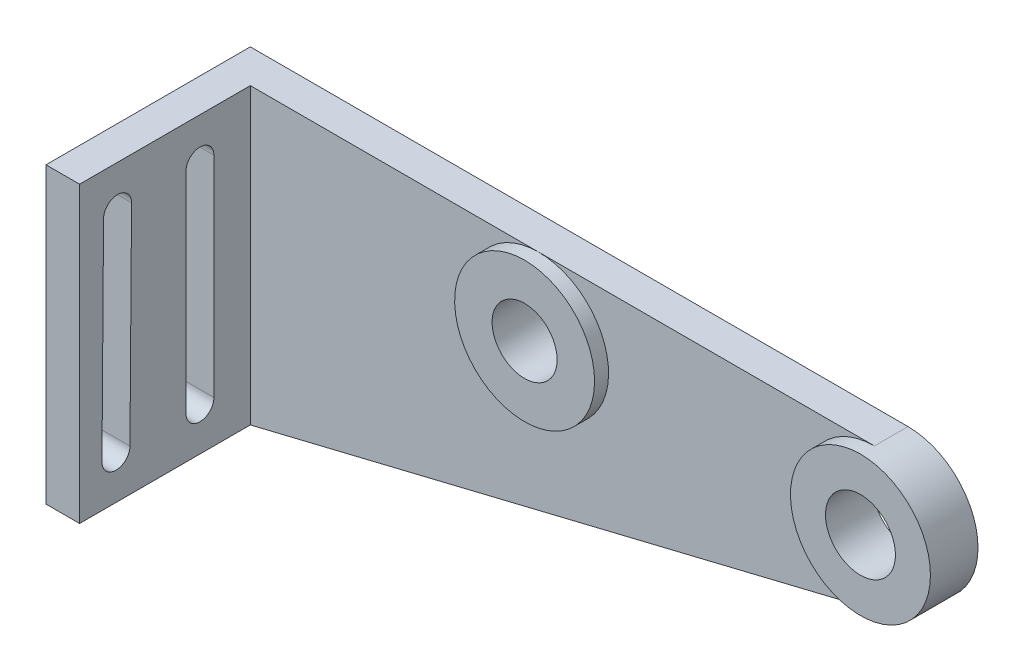
ISO-10303-21;
HEADER;
FILE_DESCRIPTION(('STEP AP214'),'2;1');
FILE_NAME('part.step','',(''),(''),'','','');
FILE_SCHEMA(('AUTOMOTIVE_DESIGN { 1 0 10303 214 1 1 1 1 }'));
ENDSEC;
DATA;
#1=APPLICATION_CONTEXT('core data for automotive mechanical design processes');
#2=APPLICATION_PROTOCOL_DEFINITION('international standard','automotive_design',2000,#1);
#3=PRODUCT_CONTEXT('',#1,'mechanical');
#4=PRODUCT('Part','Part','',(#3));
#5=PRODUCT_RELATED_PRODUCT_CATEGORY('part','',(#4));
#6=PRODUCT_DEFINITION_FORMATION('','',#4);
#7=PRODUCT_DEFINITION_CONTEXT('part definition',#1,'design');
#8=PRODUCT_DEFINITION('design','',#6,#7);
#9=PRODUCT_DEFINITION_SHAPE('','',#8);
#10=(LENGTH_UNIT() NAMED_UNIT(*) SI_UNIT(.MILLI.,.METRE.));
#11=(NAMED_UNIT(*) PLANE_ANGLE_UNIT() SI_UNIT($,.RADIAN.));
#12=(NAMED_UNIT(*) SI_UNIT($,.STERADIAN.) SOLID_ANGLE_UNIT());
#13=UNCERTAINTY_MEASURE_WITH_UNIT(LENGTH_MEASURE(1.E-05),#10,'distance_accuracy_value','');
#14=(GEOMETRIC_REPRESENTATION_CONTEXT(3) GLOBAL_UNCERTAINTY_ASSIGNED_CONTEXT((#13)) GLOBAL_UNIT_ASSIGNED_CONTEXT((#10,
#11,#12)) REPRESENTATION_CONTEXT('',''));
#15=CARTESIAN_POINT('',(0.,0.,0.));
#16=DIRECTION('',(0.,0.,1.));
#17=DIRECTION('',(1.,0.,0.));
#18=AXIS2_PLACEMENT_3D('',#15,#16,#17);
#19=CARTESIAN_POINT('',(0.,0.,12.));
#20=DIRECTION('',(0.,0.,1.));
#21=DIRECTION('',(1.,0.,0.));
#22=AXIS2_PLACEMENT_3D('',#19,#20,#21);
#23=PLANE('',#22);
#24=DIRECTION('',(0.971640503538882,0.23646296091081,0.));
#25=VECTOR('',#24,1.);
#26=CARTESIAN_POINT('',(24.7954607753983,-101.886037037208,12.));
#27=LINE('',#26,#25);
#28=CARTESIAN_POINT('',(12.,-105.,12.));
#29=VERTEX_POINT('',#28);
#30=CARTESIAN_POINT('',(240.91157402277,-49.2910125884721,12.));
#31=VERTEX_POINT('',#30);
#32=EDGE_CURVE('E323',#29,#31,#27,.T.);
#33=ORIENTED_EDGE('',*,*,#32,.T.);
#34=CARTESIAN_POINT('',(235.,-25.,12.));
#35=DIRECTION('',(0.,0.,1.));
#36=DIRECTION('',(1.,0.,0.));
#37=AXIS2_PLACEMENT_3D('',#34,#35,#36);
#38=CIRCLE('',#37,25.);
#39=CARTESIAN_POINT('',(235.,0.,12.));
#40=VERTEX_POINT('',#39);
#41=EDGE_CURVE('E268',#40,#31,#38,.T.);
#42=ORIENTED_EDGE('',*,*,#41,.F.);
#43=DIRECTION('',(1.,0.,0.));
#44=VECTOR('',#43,1.);
#45=CARTESIAN_POINT('',(0.,0.,12.));
#46=LINE('',#45,#44);
#47=CARTESIAN_POINT('',(115.,0.,12.));
#48=VERTEX_POINT('',#47);
#49=EDGE_CURVE('E326',#48,#40,#46,.T.);
#50=ORIENTED_EDGE('',*,*,#49,.F.);
#51=CARTESIAN_POINT('',(115.,-25.,12.));
#52=DIRECTION('',(0.,0.,1.));
#53=DIRECTION('',(1.,0.,0.));
#54=AXIS2_PLACEMENT_3D('',#51,#52,#53);
#55=CIRCLE('',#54,25.);
#56=EDGE_CURVE('E280',#48,#48,#55,.T.);
#57=ORIENTED_EDGE('',*,*,#56,.F.);
#58=CARTESIAN_POINT('',(12.,0.,12.));
#59=VERTEX_POINT('',#58);
#60=EDGE_CURVE('E328',#59,#48,#46,.T.);
#61=ORIENTED_EDGE('',*,*,#60,.F.);
#62=DIRECTION('',(0.,-1.,0.));
#63=VECTOR('',#62,1.);
#64=CARTESIAN_POINT('',(12.,0.,12.));
#65=LINE('',#64,#63);
#66=EDGE_CURVE('E332',#59,#29,#65,.T.);
#67=ORIENTED_EDGE('',*,*,#66,.T.);
#68=EDGE_LOOP('',(#33,#42,#50,#57,#61,#67));
#69=FACE_BOUND('',#68,.T.);
#70=ADVANCED_FACE('F62',(#69),#23,.T.);
#71=CARTESIAN_POINT('',(24.7954607753983,-101.886037037208,12.));
#72=DIRECTION('',(-0.23646296091081,0.971640503538882,0.));
#73=DIRECTION('',(-0.971640503538883,-0.23646296091081,0.));
#74=AXIS2_PLACEMENT_3D('',#71,#72,#73);
#75=PLANE('',#74);
#76=DIRECTION('',(0.971640503538882,0.23646296091081,0.));
#77=VECTOR('',#76,1.);
#78=CARTESIAN_POINT('',(24.7954607753983,-101.886037037208,0.));
#79=LINE('',#78,#77);
#80=CARTESIAN_POINT('',(12.,-105.,0.));
#81=VERTEX_POINT('',#80);
#82=CARTESIAN_POINT('',(240.91157402277,-49.2910125884721,0.));
#83=VERTEX_POINT('',#82);
#84=EDGE_CURVE('E322',#81,#83,#79,.T.);
#85=ORIENTED_EDGE('',*,*,#84,.T.);
#86=DIRECTION('',(0.,0.,-1.));
#87=VECTOR('',#86,1.);
#88=CARTESIAN_POINT('',(240.91157402277,-49.2910125884721,12.));
#89=LINE('',#88,#87);
#90=EDGE_CURVE('E14',#31,#83,#89,.T.);
#91=ORIENTED_EDGE('',*,*,#90,.F.);
#92=ORIENTED_EDGE('',*,*,#32,.F.);
#93=DIRECTION('',(0.,0.,-1.));
#94=VECTOR('',#93,1.);
#95=CARTESIAN_POINT('',(12.,-105.,12.));
#96=LINE('',#95,#94);
#97=EDGE_CURVE('E336',#29,#81,#96,.T.);
#98=ORIENTED_EDGE('',*,*,#97,.T.);
#99=EDGE_LOOP('',(#85,#91,#92,#98));
#100=FACE_BOUND('',#99,.T.);
#101=ADVANCED_FACE('F64',(#100),#75,.F.);
#102=CARTESIAN_POINT('',(235.,-25.,12.));
#103=DIRECTION('',(0.,0.,-1.));
#104=DIRECTION('',(-1.,0.,0.));
#105=AXIS2_PLACEMENT_3D('',#102,#103,#104);
#106=CYLINDRICAL_SURFACE('',#105,25.);
#107=CARTESIAN_POINT('',(235.,-25.,0.));
#108=DIRECTION('',(0.,0.,1.));
#109=DIRECTION('',(1.,0.,0.));
#110=AXIS2_PLACEMENT_3D('',#107,#108,#109);
#111=CIRCLE('',#110,25.);
#112=CARTESIAN_POINT('',(235.,0.,0.));
#113=VERTEX_POINT('',#112);
#114=EDGE_CURVE('E340',#83,#113,#111,.T.);
#115=ORIENTED_EDGE('',*,*,#114,.T.);
#116=DIRECTION('',(0.,0.,-1.));
#117=VECTOR('',#116,1.);
#118=CARTESIAN_POINT('',(235.,0.,12.));
#119=LINE('',#118,#117);
#120=EDGE_CURVE('E71',#40,#113,#119,.T.);
#121=ORIENTED_EDGE('',*,*,#120,.F.);
#122=ORIENTED_EDGE('',*,*,#41,.T.);
#123=ORIENTED_EDGE('',*,*,#90,.T.);
#124=EDGE_LOOP('',(#115,#121,#122,#123));
#125=FACE_BOUND('',#124,.T.);
#126=CARTESIAN_POINT('',(235.,-25.,17.));
#127=DIRECTION('',(0.,0.,1.));
#128=DIRECTION('',(1.,0.,0.));
#129=AXIS2_PLACEMENT_3D('',#126,#127,#128);
#130=CIRCLE('',#129,25.);
#131=CARTESIAN_POINT('',(260.,-25.,17.));
#132=VERTEX_POINT('',#131);
#133=EDGE_CURVE('E269',#132,#132,#130,.T.);
#134=ORIENTED_EDGE('',*,*,#133,.F.);
#135=EDGE_LOOP('',(#134));
#136=FACE_BOUND('',#135,.T.);
#137=ADVANCED_FACE('F365',(#125,#136),#106,.T.);
#138=CARTESIAN_POINT('',(0.,0.,12.));
#139=DIRECTION('',(0.,1.,0.));
#140=DIRECTION('',(0.,0.,1.));
#141=AXIS2_PLACEMENT_3D('',#138,#139,#140);
#142=PLANE('',#141);
#143=DIRECTION('',(1.,0.,0.));
#144=VECTOR('',#143,1.);
#145=CARTESIAN_POINT('',(0.,0.,0.));
#146=LINE('',#145,#144);
#147=CARTESIAN_POINT('',(0.,0.,0.));
#148=VERTEX_POINT('',#147);
#149=EDGE_CURVE('E344',#148,#113,#146,.T.);
#150=ORIENTED_EDGE('',*,*,#149,.F.);
#151=DIRECTION('',(0.,0.,-1.));
#152=VECTOR('',#151,1.);
#153=CARTESIAN_POINT('',(0.,0.,73.));
#154=LINE('',#153,#152);
#155=CARTESIAN_POINT('',(0.,0.,73.));
#156=VERTEX_POINT('',#155);
#157=EDGE_CURVE('E314',#156,#148,#154,.T.);
#158=ORIENTED_EDGE('',*,*,#157,.F.);
#159=DIRECTION('',(1.,0.,0.));
#160=VECTOR('',#159,1.);
#161=CARTESIAN_POINT('',(0.,0.,73.));
#162=LINE('',#161,#160);
#163=CARTESIAN_POINT('',(12.,0.,73.));
#164=VERTEX_POINT('',#163);
#165=EDGE_CURVE('E292',#156,#164,#162,.T.);
#166=ORIENTED_EDGE('',*,*,#165,.T.);
#167=DIRECTION('',(0.,0.,-1.));
#168=VECTOR('',#167,1.);
#169=CARTESIAN_POINT('',(12.,0.,73.));
#170=LINE('',#169,#168);
#171=EDGE_CURVE('E318',#164,#59,#170,.T.);
#172=ORIENTED_EDGE('',*,*,#171,.T.);
#173=ORIENTED_EDGE('',*,*,#60,.T.);
#174=ORIENTED_EDGE('',*,*,#49,.T.);
#175=ORIENTED_EDGE('',*,*,#120,.T.);
#176=EDGE_LOOP('',(#150,#158,#166,#172,#173,#174,#175));
#177=FACE_BOUND('',#176,.T.);
#178=ADVANCED_FACE('F361',(#177),#142,.T.);
#179=CARTESIAN_POINT('',(115.,-25.,12.));
#180=DIRECTION('',(0.,0.,-1.));
#181=DIRECTION('',(-1.,0.,0.));
#182=AXIS2_PLACEMENT_3D('',#179,#180,#181);
#183=CYLINDRICAL_SURFACE('',#182,11.619106241163);
#184=CARTESIAN_POINT('',(115.,-25.,0.));
#185=DIRECTION('',(0.,0.,1.));
#186=DIRECTION('',(1.,0.,0.));
#187=AXIS2_PLACEMENT_3D('',#184,#185,#186);
#188=CIRCLE('',#187,11.619106241163);
#189=CARTESIAN_POINT('',(126.619106241163,-25.,0.));
#190=VERTEX_POINT('',#189);
#191=EDGE_CURVE('E348',#190,#190,#188,.T.);
#192=ORIENTED_EDGE('',*,*,#191,.F.);
#193=EDGE_LOOP('',(#192));
#194=FACE_BOUND('',#193,.T.);
#195=CARTESIAN_POINT('',(115.,-25.,17.));
#196=DIRECTION('',(0.,0.,1.));
#197=DIRECTION('',(1.,0.,0.));
#198=AXIS2_PLACEMENT_3D('',#195,#196,#197);
#199=CIRCLE('',#198,11.619106241163);
#200=CARTESIAN_POINT('',(126.619106241163,-25.,17.));
#201=VERTEX_POINT('',#200);
#202=EDGE_CURVE('E273',#201,#201,#199,.T.);
#203=ORIENTED_EDGE('',*,*,#202,.T.);
#204=EDGE_LOOP('',(#203));
#205=FACE_BOUND('',#204,.T.);
#206=ADVANCED_FACE('F424',(#194,#205),#183,.F.);
#207=CARTESIAN_POINT('',(235.,-25.,12.));
#208=DIRECTION('',(0.,0.,-1.));
#209=DIRECTION('',(-1.,0.,0.));
#210=AXIS2_PLACEMENT_3D('',#207,#208,#209);
#211=CYLINDRICAL_SURFACE('',#210,12.5);
#212=CARTESIAN_POINT('',(235.,-25.,0.));
#213=DIRECTION('',(0.,0.,1.));
#214=DIRECTION('',(1.,0.,0.));
#215=AXIS2_PLACEMENT_3D('',#212,#213,#214);
#216=CIRCLE('',#215,12.5);
#217=CARTESIAN_POINT('',(247.5,-25.,0.));
#218=VERTEX_POINT('',#217);
#219=EDGE_CURVE('E327',#218,#218,#216,.T.);
#220=ORIENTED_EDGE('',*,*,#219,.F.);
#221=EDGE_LOOP('',(#220));
#222=FACE_BOUND('',#221,.T.);
#223=CARTESIAN_POINT('',(235.,-25.,17.));
#224=DIRECTION('',(0.,0.,1.));
#225=DIRECTION('',(1.,0.,0.));
#226=AXIS2_PLACEMENT_3D('',#223,#224,#225);
#227=CIRCLE('',#226,12.5);
#228=CARTESIAN_POINT('',(247.5,-25.,17.));
#229=VERTEX_POINT('',#228);
#230=EDGE_CURVE('E218',#229,#229,#227,.T.);
#231=ORIENTED_EDGE('',*,*,#230,.T.);
#232=EDGE_LOOP('',(#231));
#233=FACE_BOUND('',#232,.T.);
#234=ADVANCED_FACE('F421',(#222,#233),#211,.F.);
#235=CARTESIAN_POINT('',(0.,0.,0.));
#236=DIRECTION('',(0.,0.,1.));
#237=DIRECTION('',(1.,0.,0.));
#238=AXIS2_PLACEMENT_3D('',#235,#236,#237);
#239=PLANE('',#238);
#240=ORIENTED_EDGE('',*,*,#84,.F.);
#241=DIRECTION('',(1.,0.,0.));
#242=VECTOR('',#241,1.);
#243=CARTESIAN_POINT('',(0.,-105.,0.));
#244=LINE('',#243,#242);
#245=CARTESIAN_POINT('',(0.,-105.,0.));
#246=VERTEX_POINT('',#245);
#247=EDGE_CURVE('E293',#246,#81,#244,.T.);
#248=ORIENTED_EDGE('',*,*,#247,.F.);
#249=DIRECTION('',(0.,-1.,0.));
#250=VECTOR('',#249,1.);
#251=CARTESIAN_POINT('',(0.,0.,0.));
#252=LINE('',#251,#250);
#253=EDGE_CURVE('E285',#148,#246,#252,.T.);
#254=ORIENTED_EDGE('',*,*,#253,.F.);
#255=ORIENTED_EDGE('',*,*,#149,.T.);
#256=ORIENTED_EDGE('',*,*,#114,.F.);
#257=EDGE_LOOP('',(#240,#248,#254,#255,#256));
#258=FACE_BOUND('',#257,.T.);
#259=ORIENTED_EDGE('',*,*,#191,.T.);
#260=EDGE_LOOP('',(#259));
#261=FACE_BOUND('',#260,.T.);
#262=ORIENTED_EDGE('',*,*,#219,.T.);
#263=EDGE_LOOP('',(#262));
#264=FACE_BOUND('',#263,.T.);
#265=ADVANCED_FACE('F371',(#258,#261,#264),#239,.F.);
#266=CARTESIAN_POINT('',(12.,0.,73.));
#267=DIRECTION('',(1.,0.,0.));
#268=DIRECTION('',(0.,1.,0.));
#269=AXIS2_PLACEMENT_3D('',#266,#267,#268);
#270=PLANE('',#269);
#271=CARTESIAN_POINT('',(12.,-15.,59.4348922530254));
#272=DIRECTION('',(1.,0.,0.));
#273=DIRECTION('',(0.,1.,0.));
#274=AXIS2_PLACEMENT_3D('',#271,#272,#273);
#275=CIRCLE('',#274,5.);
#276=CARTESIAN_POINT('',(12.,-15.0376727804197,54.4350341788781));
#277=VERTEX_POINT('',#276);
#278=CARTESIAN_POINT('',(12.,-14.9623272195803,64.4347503271726));
#279=VERTEX_POINT('',#278);
#280=EDGE_CURVE('E78',#277,#279,#275,.T.);
#281=ORIENTED_EDGE('',*,*,#280,.F.);
#282=DIRECTION('',(0.,0.99997161482945,-0.00753455608393091));
#283=VECTOR('',#282,1.);
#284=CARTESIAN_POINT('',(12.,-15.0376727804197,54.4350341788781));
#285=LINE('',#284,#283);
#286=CARTESIAN_POINT('',(12.,-90.0376727804196,55.0001419258527));
#287=VERTEX_POINT('',#286);
#288=EDGE_CURVE('E194',#287,#277,#285,.T.);
#289=ORIENTED_EDGE('',*,*,#288,.F.);
#290=CARTESIAN_POINT('',(12.,-90.,60.));
#291=DIRECTION('',(1.,0.,0.));
#292=DIRECTION('',(0.,1.,0.));
#293=AXIS2_PLACEMENT_3D('',#290,#291,#292);
#294=CIRCLE('',#293,5.);
#295=CARTESIAN_POINT('',(12.,-89.9623272195803,64.9998580741472));
#296=VERTEX_POINT('',#295);
#297=EDGE_CURVE('E199',#296,#287,#294,.T.);
#298=ORIENTED_EDGE('',*,*,#297,.F.);
#299=DIRECTION('',(0.,-0.99997161482945,0.00753455608393082));
#300=VECTOR('',#299,1.);
#301=CARTESIAN_POINT('',(12.,-14.9623272195803,64.4347503271726));
#302=LINE('',#301,#300);
#303=EDGE_CURVE('E208',#279,#296,#302,.T.);
#304=ORIENTED_EDGE('',*,*,#303,.F.);
#305=EDGE_LOOP('',(#281,#289,#298,#304));
#306=FACE_BOUND('',#305,.T.);
#307=CARTESIAN_POINT('',(12.,-15.,30.));
#308=DIRECTION('',(1.,0.,0.));
#309=DIRECTION('',(0.,1.,0.));
#310=AXIS2_PLACEMENT_3D('',#307,#308,#309);
#311=CIRCLE('',#310,5.00000000000002);
#312=CARTESIAN_POINT('',(12.,-15.,25.));
#313=VERTEX_POINT('',#312);
#314=CARTESIAN_POINT('',(12.,-15.,35.));
#315=VERTEX_POINT('',#314);
#316=EDGE_CURVE('E86',#313,#315,#311,.T.);
#317=ORIENTED_EDGE('',*,*,#316,.F.);
#318=DIRECTION('',(0.,1.,0.));
#319=VECTOR('',#318,1.);
#320=CARTESIAN_POINT('',(12.,-15.,25.));
#321=LINE('',#320,#319);
#322=CARTESIAN_POINT('',(12.,-90.,25.));
#323=VERTEX_POINT('',#322);
#324=EDGE_CURVE('E229',#323,#313,#321,.T.);
#325=ORIENTED_EDGE('',*,*,#324,.F.);
#326=CARTESIAN_POINT('',(12.,-90.,30.));
#327=DIRECTION('',(1.,0.,0.));
#328=DIRECTION('',(0.,1.,0.));
#329=AXIS2_PLACEMENT_3D('',#326,#327,#328);
#330=CIRCLE('',#329,5.00000000000002);
#331=CARTESIAN_POINT('',(12.,-90.,35.));
#332=VERTEX_POINT('',#331);
#333=EDGE_CURVE('E248',#332,#323,#330,.T.);
#334=ORIENTED_EDGE('',*,*,#333,.F.);
#335=DIRECTION('',(0.,-1.,0.));
#336=VECTOR('',#335,1.);
#337=CARTESIAN_POINT('',(12.,-15.,35.));
#338=LINE('',#337,#336);
#339=EDGE_CURVE('E244',#315,#332,#338,.T.);
#340=ORIENTED_EDGE('',*,*,#339,.F.);
#341=EDGE_LOOP('',(#317,#325,#334,#340));
#342=FACE_BOUND('',#341,.T.);
#343=ORIENTED_EDGE('',*,*,#66,.F.);
#344=ORIENTED_EDGE('',*,*,#171,.F.);
#345=DIRECTION('',(0.,-1.,0.));
#346=VECTOR('',#345,1.);
#347=CARTESIAN_POINT('',(12.,0.,73.));
#348=LINE('',#347,#346);
#349=CARTESIAN_POINT('',(12.,-105.,73.));
#350=VERTEX_POINT('',#349);
#351=EDGE_CURVE('E288',#164,#350,#348,.T.);
#352=ORIENTED_EDGE('',*,*,#351,.T.);
#353=DIRECTION('',(0.,0.,-1.));
#354=VECTOR('',#353,1.);
#355=CARTESIAN_POINT('',(12.,-105.,73.));
#356=LINE('',#355,#354);
#357=EDGE_CURVE('E303',#350,#29,#356,.T.);
#358=ORIENTED_EDGE('',*,*,#357,.T.);
#359=EDGE_LOOP('',(#343,#344,#352,#358));
#360=FACE_BOUND('',#359,.T.);
#361=ADVANCED_FACE('F417',(#306,#342,#360),#270,.T.);
#362=CARTESIAN_POINT('',(0.,0.,73.));
#363=DIRECTION('',(1.,0.,0.));
#364=DIRECTION('',(0.,1.,0.));
#365=AXIS2_PLACEMENT_3D('',#362,#363,#364);
#366=PLANE('',#365);
#367=DIRECTION('',(0.,0.99997161482945,-0.00753455608393091));
#368=VECTOR('',#367,1.);
#369=CARTESIAN_POINT('',(0.,-15.0376727804197,54.4350341788781));
#370=LINE('',#369,#368);
#371=CARTESIAN_POINT('',(0.,-90.0376727804196,55.0001419258527));
#372=VERTEX_POINT('',#371);
#373=CARTESIAN_POINT('',(0.,-15.0376727804197,54.4350341788781));
#374=VERTEX_POINT('',#373);
#375=EDGE_CURVE('E179',#372,#374,#370,.T.);
#376=ORIENTED_EDGE('',*,*,#375,.T.);
#377=CARTESIAN_POINT('',(0.,-15.,59.4348922530254));
#378=DIRECTION('',(1.,0.,0.));
#379=DIRECTION('',(0.,1.,0.));
#380=AXIS2_PLACEMENT_3D('',#377,#378,#379);
#381=CIRCLE('',#380,5.);
#382=CARTESIAN_POINT('',(0.,-14.9623272195803,64.4347503271726));
#383=VERTEX_POINT('',#382);
#384=EDGE_CURVE('E172',#374,#383,#381,.T.);
#385=ORIENTED_EDGE('',*,*,#384,.T.);
#386=DIRECTION('',(0.,-0.99997161482945,0.00753455608393082));
#387=VECTOR('',#386,1.);
#388=CARTESIAN_POINT('',(0.,-14.9623272195803,64.4347503271726));
#389=LINE('',#388,#387);
#390=CARTESIAN_POINT('',(0.,-89.9623272195803,64.9998580741472));
#391=VERTEX_POINT('',#390);
#392=EDGE_CURVE('E183',#383,#391,#389,.T.);
#393=ORIENTED_EDGE('',*,*,#392,.T.);
#394=CARTESIAN_POINT('',(0.,-90.,60.));
#395=DIRECTION('',(1.,0.,0.));
#396=DIRECTION('',(0.,1.,0.));
#397=AXIS2_PLACEMENT_3D('',#394,#395,#396);
#398=CIRCLE('',#397,5.);
#399=EDGE_CURVE('E188',#391,#372,#398,.T.);
#400=ORIENTED_EDGE('',*,*,#399,.T.);
#401=EDGE_LOOP('',(#376,#385,#393,#400));
#402=FACE_BOUND('',#401,.T.);
#403=DIRECTION('',(0.,1.,0.));
#404=VECTOR('',#403,1.);
#405=CARTESIAN_POINT('',(0.,-15.,25.));
#406=LINE('',#405,#404);
#407=CARTESIAN_POINT('',(0.,-90.,25.));
#408=VERTEX_POINT('',#407);
#409=CARTESIAN_POINT('',(0.,-15.,25.));
#410=VERTEX_POINT('',#409);
#411=EDGE_CURVE('E237',#408,#410,#406,.T.);
#412=ORIENTED_EDGE('',*,*,#411,.T.);
#413=CARTESIAN_POINT('',(0.,-15.,30.));
#414=DIRECTION('',(1.,0.,0.));
#415=DIRECTION('',(0.,1.,0.));
#416=AXIS2_PLACEMENT_3D('',#413,#414,#415);
#417=CIRCLE('',#416,5.00000000000002);
#418=CARTESIAN_POINT('',(0.,-15.,35.));
#419=VERTEX_POINT('',#418);
#420=EDGE_CURVE('E224',#410,#419,#417,.T.);
#421=ORIENTED_EDGE('',*,*,#420,.T.);
#422=DIRECTION('',(0.,-1.,0.));
#423=VECTOR('',#422,1.);
#424=CARTESIAN_POINT('',(0.,-15.,35.));
#425=LINE('',#424,#423);
#426=CARTESIAN_POINT('',(0.,-90.,35.));
#427=VERTEX_POINT('',#426);
#428=EDGE_CURVE('E228',#419,#427,#425,.T.);
#429=ORIENTED_EDGE('',*,*,#428,.T.);
#430=CARTESIAN_POINT('',(0.,-90.,30.));
#431=DIRECTION('',(1.,0.,0.));
#432=DIRECTION('',(0.,1.,0.));
#433=AXIS2_PLACEMENT_3D('',#430,#431,#432);
#434=CIRCLE('',#433,5.00000000000002);
#435=EDGE_CURVE('E233',#427,#408,#434,.T.);
#436=ORIENTED_EDGE('',*,*,#435,.T.);
#437=EDGE_LOOP('',(#412,#421,#429,#436));
#438=FACE_BOUND('',#437,.T.);
#439=ORIENTED_EDGE('',*,*,#253,.T.);
#440=DIRECTION('',(0.,0.,-1.));
#441=VECTOR('',#440,1.);
#442=CARTESIAN_POINT('',(0.,-105.,73.));
#443=LINE('',#442,#441);
#444=CARTESIAN_POINT('',(0.,-105.,73.));
#445=VERTEX_POINT('',#444);
#446=EDGE_CURVE('E310',#445,#246,#443,.T.);
#447=ORIENTED_EDGE('',*,*,#446,.F.);
#448=DIRECTION('',(0.,-1.,0.));
#449=VECTOR('',#448,1.);
#450=CARTESIAN_POINT('',(0.,0.,73.));
#451=LINE('',#450,#449);
#452=EDGE_CURVE('E297',#156,#445,#451,.T.);
#453=ORIENTED_EDGE('',*,*,#452,.F.);
#454=ORIENTED_EDGE('',*,*,#157,.T.);
#455=EDGE_LOOP('',(#439,#447,#453,#454));
#456=FACE_BOUND('',#455,.T.);
#457=ADVANCED_FACE('F190',(#402,#438,#456),#366,.F.);
#458=CARTESIAN_POINT('',(0.,-105.,73.));
#459=DIRECTION('',(0.,1.,0.));
#460=DIRECTION('',(0.,0.,1.));
#461=AXIS2_PLACEMENT_3D('',#458,#459,#460);
#462=PLANE('',#461);
#463=ORIENTED_EDGE('',*,*,#247,.T.);
#464=ORIENTED_EDGE('',*,*,#97,.F.);
#465=ORIENTED_EDGE('',*,*,#357,.F.);
#466=DIRECTION('',(1.,0.,0.));
#467=VECTOR('',#466,1.);
#468=CARTESIAN_POINT('',(0.,-105.,73.));
#469=LINE('',#468,#467);
#470=EDGE_CURVE('E300',#445,#350,#469,.T.);
#471=ORIENTED_EDGE('',*,*,#470,.F.);
#472=ORIENTED_EDGE('',*,*,#446,.T.);
#473=EDGE_LOOP('',(#463,#464,#465,#471,#472));
#474=FACE_BOUND('',#473,.T.);
#475=ADVANCED_FACE('F379',(#474),#462,.F.);
#476=CARTESIAN_POINT('',(0.,0.,73.));
#477=DIRECTION('',(0.,0.,1.));
#478=DIRECTION('',(1.,0.,0.));
#479=AXIS2_PLACEMENT_3D('',#476,#477,#478);
#480=PLANE('',#479);
#481=ORIENTED_EDGE('',*,*,#351,.F.);
#482=ORIENTED_EDGE('',*,*,#165,.F.);
#483=ORIENTED_EDGE('',*,*,#452,.T.);
#484=ORIENTED_EDGE('',*,*,#470,.T.);
#485=EDGE_LOOP('',(#481,#482,#483,#484));
#486=FACE_BOUND('',#485,.T.);
#487=ADVANCED_FACE('F384',(#486),#480,.T.);
#488=CARTESIAN_POINT('',(115.,-25.,17.));
#489=DIRECTION('',(0.,0.,1.));
#490=DIRECTION('',(1.,0.,0.));
#491=AXIS2_PLACEMENT_3D('',#488,#489,#490);
#492=PLANE('',#491);
#493=CARTESIAN_POINT('',(115.,-25.,17.));
#494=DIRECTION('',(0.,0.,1.));
#495=DIRECTION('',(1.,0.,0.));
#496=AXIS2_PLACEMENT_3D('',#493,#494,#495);
#497=CIRCLE('',#496,25.);
#498=CARTESIAN_POINT('',(140.,-25.,17.));
#499=VERTEX_POINT('',#498);
#500=EDGE_CURVE('E281',#499,#499,#497,.T.);
#501=ORIENTED_EDGE('',*,*,#500,.T.);
#502=EDGE_LOOP('',(#501));
#503=FACE_BOUND('',#502,.T.);
#504=ORIENTED_EDGE('',*,*,#202,.F.);
#505=EDGE_LOOP('',(#504));
#506=FACE_BOUND('',#505,.T.);
#507=ADVANCED_FACE('F395',(#503,#506),#492,.T.);
#508=CARTESIAN_POINT('',(115.,-25.,17.));
#509=DIRECTION('',(0.,0.,-1.));
#510=DIRECTION('',(-1.,0.,0.));
#511=AXIS2_PLACEMENT_3D('',#508,#509,#510);
#512=CYLINDRICAL_SURFACE('',#511,25.);
#513=ORIENTED_EDGE('',*,*,#500,.F.);
#514=EDGE_LOOP('',(#513));
#515=FACE_BOUND('',#514,.T.);
#516=ORIENTED_EDGE('',*,*,#56,.T.);
#517=EDGE_LOOP('',(#516));
#518=FACE_BOUND('',#517,.T.);
#519=ADVANCED_FACE('F392',(#515,#518),#512,.T.);
#520=CARTESIAN_POINT('',(235.,-25.,17.));
#521=DIRECTION('',(0.,0.,1.));
#522=DIRECTION('',(1.,0.,0.));
#523=AXIS2_PLACEMENT_3D('',#520,#521,#522);
#524=PLANE('',#523);
#525=ORIENTED_EDGE('',*,*,#133,.T.);
#526=EDGE_LOOP('',(#525));
#527=FACE_BOUND('',#526,.T.);
#528=ORIENTED_EDGE('',*,*,#230,.F.);
#529=EDGE_LOOP('',(#528));
#530=FACE_BOUND('',#529,.T.);
#531=ADVANCED_FACE('F394',(#527,#530),#524,.T.);
#532=CARTESIAN_POINT('',(0.,-15.,30.));
#533=DIRECTION('',(1.,0.,0.));
#534=DIRECTION('',(0.,1.,0.));
#535=AXIS2_PLACEMENT_3D('',#532,#533,#534);
#536=CYLINDRICAL_SURFACE('',#535,5.00000000000002);
#537=ORIENTED_EDGE('',*,*,#316,.T.);
#538=DIRECTION('',(1.,0.,0.));
#539=VECTOR('',#538,1.);
#540=CARTESIAN_POINT('',(0.,-15.,35.));
#541=LINE('',#540,#539);
#542=EDGE_CURVE('E241',#419,#315,#541,.T.);
#543=ORIENTED_EDGE('',*,*,#542,.F.);
#544=ORIENTED_EDGE('',*,*,#420,.F.);
#545=DIRECTION('',(1.,0.,0.));
#546=VECTOR('',#545,1.);
#547=CARTESIAN_POINT('',(0.,-15.,25.));
#548=LINE('',#547,#546);
#549=EDGE_CURVE('E209',#410,#313,#548,.T.);
#550=ORIENTED_EDGE('',*,*,#549,.T.);
#551=EDGE_LOOP('',(#537,#543,#544,#550));
#552=FACE_BOUND('',#551,.T.);
#553=ADVANCED_FACE('F402',(#552),#536,.F.);
#554=CARTESIAN_POINT('',(0.,-15.,25.));
#555=DIRECTION('',(0.,0.,-1.));
#556=DIRECTION('',(0.,1.,0.));
#557=AXIS2_PLACEMENT_3D('',#554,#555,#556);
#558=PLANE('',#557);
#559=ORIENTED_EDGE('',*,*,#324,.T.);
#560=ORIENTED_EDGE('',*,*,#549,.F.);
#561=ORIENTED_EDGE('',*,*,#411,.F.);
#562=DIRECTION('',(1.,0.,0.));
#563=VECTOR('',#562,1.);
#564=CARTESIAN_POINT('',(0.,-90.,25.));
#565=LINE('',#564,#563);
#566=EDGE_CURVE('E257',#408,#323,#565,.T.);
#567=ORIENTED_EDGE('',*,*,#566,.T.);
#568=EDGE_LOOP('',(#559,#560,#561,#567));
#569=FACE_BOUND('',#568,.T.);
#570=ADVANCED_FACE('F496',(#569),#558,.F.);
#571=CARTESIAN_POINT('',(0.,-90.,30.));
#572=DIRECTION('',(1.,0.,0.));
#573=DIRECTION('',(0.,1.,0.));
#574=AXIS2_PLACEMENT_3D('',#571,#572,#573);
#575=CYLINDRICAL_SURFACE('',#574,5.00000000000002);
#576=ORIENTED_EDGE('',*,*,#333,.T.);
#577=ORIENTED_EDGE('',*,*,#566,.F.);
#578=ORIENTED_EDGE('',*,*,#435,.F.);
#579=DIRECTION('',(1.,0.,0.));
#580=VECTOR('',#579,1.);
#581=CARTESIAN_POINT('',(0.,-90.,35.));
#582=LINE('',#581,#580);
#583=EDGE_CURVE('E260',#427,#332,#582,.T.);
#584=ORIENTED_EDGE('',*,*,#583,.T.);
#585=EDGE_LOOP('',(#576,#577,#578,#584));
#586=FACE_BOUND('',#585,.T.);
#587=ADVANCED_FACE('F505',(#586),#575,.F.);
#588=CARTESIAN_POINT('',(0.,-15.,35.));
#589=DIRECTION('',(0.,0.,1.));
#590=DIRECTION('',(0.,-1.,0.));
#591=AXIS2_PLACEMENT_3D('',#588,#589,#590);
#592=PLANE('',#591);
#593=ORIENTED_EDGE('',*,*,#339,.T.);
#594=ORIENTED_EDGE('',*,*,#583,.F.);
#595=ORIENTED_EDGE('',*,*,#428,.F.);
#596=ORIENTED_EDGE('',*,*,#542,.T.);
#597=EDGE_LOOP('',(#593,#594,#595,#596));
#598=FACE_BOUND('',#597,.T.);
#599=ADVANCED_FACE('F515',(#598),#592,.F.);
#600=CARTESIAN_POINT('',(0.,-15.,59.4348922530254));
#601=DIRECTION('',(1.,0.,0.));
#602=DIRECTION('',(0.,1.,0.));
#603=AXIS2_PLACEMENT_3D('',#600,#601,#602);
#604=CYLINDRICAL_SURFACE('',#603,5.);
#605=ORIENTED_EDGE('',*,*,#280,.T.);
#606=DIRECTION('',(1.,0.,0.));
#607=VECTOR('',#606,1.);
#608=CARTESIAN_POINT('',(0.,-14.9623272195803,64.4347503271726));
#609=LINE('',#608,#607);
#610=EDGE_CURVE('E168',#383,#279,#609,.T.);
#611=ORIENTED_EDGE('',*,*,#610,.F.);
#612=ORIENTED_EDGE('',*,*,#384,.F.);
#613=DIRECTION('',(1.,0.,0.));
#614=VECTOR('',#613,1.);
#615=CARTESIAN_POINT('',(0.,-15.0376727804197,54.4350341788781));
#616=LINE('',#615,#614);
#617=EDGE_CURVE('E215',#374,#277,#616,.T.);
#618=ORIENTED_EDGE('',*,*,#617,.T.);
#619=EDGE_LOOP('',(#605,#611,#612,#618));
#620=FACE_BOUND('',#619,.T.);
#621=ADVANCED_FACE('F170',(#620),#604,.F.);
#622=CARTESIAN_POINT('',(0.,-15.0376727804197,54.4350341788781));
#623=DIRECTION('',(0.,-0.00753455608393091,-0.99997161482945));
#624=DIRECTION('',(0.,0.99997161482945,-0.00753455608393092));
#625=AXIS2_PLACEMENT_3D('',#622,#623,#624);
#626=PLANE('',#625);
#627=ORIENTED_EDGE('',*,*,#288,.T.);
#628=ORIENTED_EDGE('',*,*,#617,.F.);
#629=ORIENTED_EDGE('',*,*,#375,.F.);
#630=DIRECTION('',(1.,0.,0.));
#631=VECTOR('',#630,1.);
#632=CARTESIAN_POINT('',(0.,-90.0376727804196,55.0001419258527));
#633=LINE('',#632,#631);
#634=EDGE_CURVE('E219',#372,#287,#633,.T.);
#635=ORIENTED_EDGE('',*,*,#634,.T.);
#636=EDGE_LOOP('',(#627,#628,#629,#635));
#637=FACE_BOUND('',#636,.T.);
#638=ADVANCED_FACE('F534',(#637),#626,.F.);
#639=CARTESIAN_POINT('',(0.,-90.,60.));
#640=DIRECTION('',(1.,0.,0.));
#641=DIRECTION('',(0.,1.,0.));
#642=AXIS2_PLACEMENT_3D('',#639,#640,#641);
#643=CYLINDRICAL_SURFACE('',#642,5.);
#644=ORIENTED_EDGE('',*,*,#297,.T.);
#645=ORIENTED_EDGE('',*,*,#634,.F.);
#646=ORIENTED_EDGE('',*,*,#399,.F.);
#647=DIRECTION('',(1.,0.,0.));
#648=VECTOR('',#647,1.);
#649=CARTESIAN_POINT('',(0.,-89.9623272195803,64.9998580741472));
#650=LINE('',#649,#648);
#651=EDGE_CURVE('E178',#391,#296,#650,.T.);
#652=ORIENTED_EDGE('',*,*,#651,.T.);
#653=EDGE_LOOP('',(#644,#645,#646,#652));
#654=FACE_BOUND('',#653,.T.);
#655=ADVANCED_FACE('F543',(#654),#643,.F.);
#656=CARTESIAN_POINT('',(0.,-14.9623272195803,64.4347503271726));
#657=DIRECTION('',(0.,0.00753455608393082,0.99997161482945));
#658=DIRECTION('',(0.,-0.99997161482945,0.00753455608393082));
#659=AXIS2_PLACEMENT_3D('',#656,#657,#658);
#660=PLANE('',#659);
#661=ORIENTED_EDGE('',*,*,#303,.T.);
#662=ORIENTED_EDGE('',*,*,#651,.F.);
#663=ORIENTED_EDGE('',*,*,#392,.F.);
#664=ORIENTED_EDGE('',*,*,#610,.T.);
#665=EDGE_LOOP('',(#661,#662,#663,#664));
#666=FACE_BOUND('',#665,.T.);
#667=ADVANCED_FACE('F184',(#666),#660,.F.);
#668=CLOSED_SHELL('',(#70,#101,#137,#178,#206,#234,#265,#361,#457,#475,#487,#507,#519,#531,#553,
#570,#587,#599,#621,#638,#655,#667));
#669=MANIFOLD_SOLID_BREP('B2',#668);
#670=ADVANCED_BREP_SHAPE_REPRESENTATION('',(#18,#669),#14);
#671=SHAPE_DEFINITION_REPRESENTATION(#9,#670);
ENDSEC;
END-ISO-10303-21;
